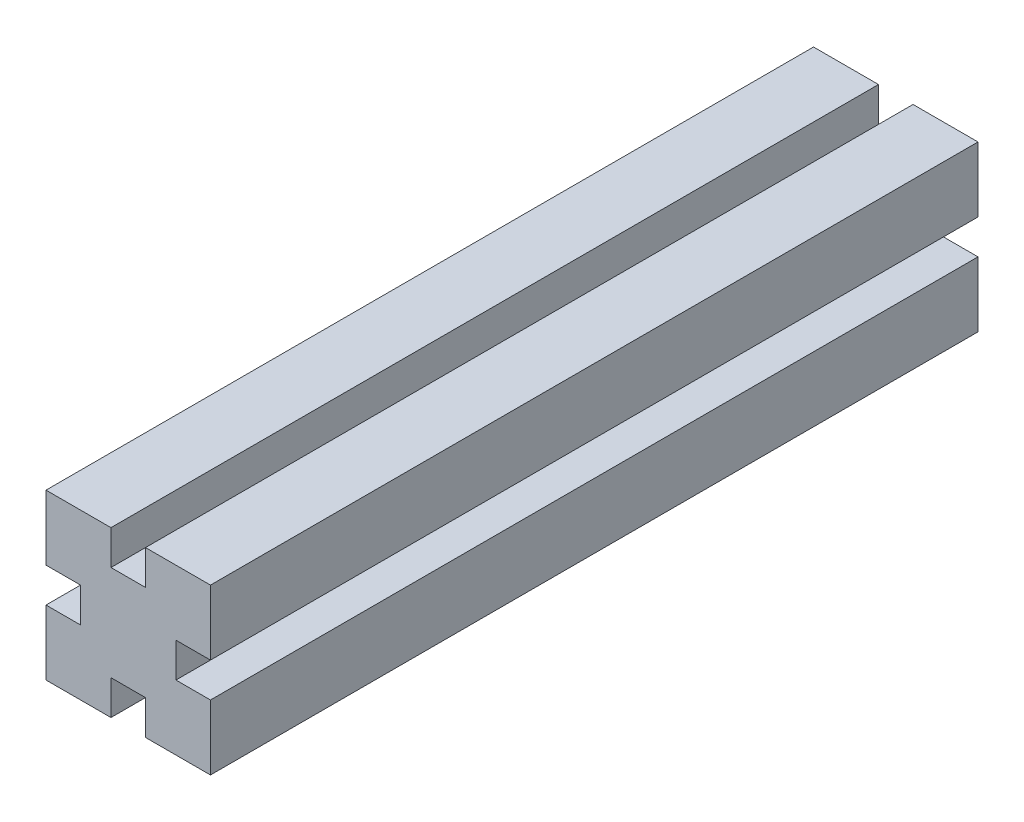
ISO-10303-21;
HEADER;
FILE_DESCRIPTION(('STEP AP214'),'2;1');
FILE_NAME('part.step','',(''),(''),'','','');
FILE_SCHEMA(('AUTOMOTIVE_DESIGN { 1 0 10303 214 1 1 1 1 }'));
ENDSEC;
DATA;
#1=APPLICATION_CONTEXT('core data for automotive mechanical design processes');
#2=APPLICATION_PROTOCOL_DEFINITION('international standard','automotive_design',2000,#1);
#3=PRODUCT_CONTEXT('',#1,'mechanical');
#4=PRODUCT('Part','Part','',(#3));
#5=PRODUCT_RELATED_PRODUCT_CATEGORY('part','',(#4));
#6=PRODUCT_DEFINITION_FORMATION('','',#4);
#7=PRODUCT_DEFINITION_CONTEXT('part definition',#1,'design');
#8=PRODUCT_DEFINITION('design','',#6,#7);
#9=PRODUCT_DEFINITION_SHAPE('','',#8);
#10=(LENGTH_UNIT() NAMED_UNIT(*) SI_UNIT(.MILLI.,.METRE.));
#11=(NAMED_UNIT(*) PLANE_ANGLE_UNIT() SI_UNIT($,.RADIAN.));
#12=(NAMED_UNIT(*) SI_UNIT($,.STERADIAN.) SOLID_ANGLE_UNIT());
#13=UNCERTAINTY_MEASURE_WITH_UNIT(LENGTH_MEASURE(1.E-05),#10,'distance_accuracy_value','');
#14=(GEOMETRIC_REPRESENTATION_CONTEXT(3) GLOBAL_UNCERTAINTY_ASSIGNED_CONTEXT((#13)) GLOBAL_UNIT_ASSIGNED_CONTEXT((#10,
#11,#12)) REPRESENTATION_CONTEXT('',''));
#15=CARTESIAN_POINT('',(0.,0.,0.));
#16=DIRECTION('',(0.,0.,1.));
#17=DIRECTION('',(1.,0.,0.));
#18=AXIS2_PLACEMENT_3D('',#15,#16,#17);
#19=CARTESIAN_POINT('',(-19.05,-4.,177.8));
#20=DIRECTION('',(1.,0.,0.));
#21=DIRECTION('',(0.,0.,-1.));
#22=AXIS2_PLACEMENT_3D('',#19,#20,#21);
#23=PLANE('',#22);
#24=DIRECTION('',(0.,-1.,0.));
#25=VECTOR('',#24,1.);
#26=CARTESIAN_POINT('',(-19.05,-4.,0.));
#27=LINE('',#26,#25);
#28=CARTESIAN_POINT('',(-19.05,-4.,0.));
#29=VERTEX_POINT('',#28);
#30=CARTESIAN_POINT('',(-19.05,-19.05,0.));
#31=VERTEX_POINT('',#30);
#32=EDGE_CURVE('E207',#29,#31,#27,.T.);
#33=ORIENTED_EDGE('',*,*,#32,.T.);
#34=DIRECTION('',(0.,0.,-1.));
#35=VECTOR('',#34,1.);
#36=CARTESIAN_POINT('',(-19.05,-19.05,177.8));
#37=LINE('',#36,#35);
#38=CARTESIAN_POINT('',(-19.05,-19.05,177.8));
#39=VERTEX_POINT('',#38);
#40=EDGE_CURVE('E11',#39,#31,#37,.T.);
#41=ORIENTED_EDGE('',*,*,#40,.F.);
#42=DIRECTION('',(0.,-1.,0.));
#43=VECTOR('',#42,1.);
#44=CARTESIAN_POINT('',(-19.05,-4.,177.8));
#45=LINE('',#44,#43);
#46=CARTESIAN_POINT('',(-19.05,-4.,177.8));
#47=VERTEX_POINT('',#46);
#48=EDGE_CURVE('E245',#47,#39,#45,.T.);
#49=ORIENTED_EDGE('',*,*,#48,.F.);
#50=DIRECTION('',(0.,0.,-1.));
#51=VECTOR('',#50,1.);
#52=CARTESIAN_POINT('',(-19.05,-4.,177.8));
#53=LINE('',#52,#51);
#54=EDGE_CURVE('E203',#47,#29,#53,.T.);
#55=ORIENTED_EDGE('',*,*,#54,.T.);
#56=EDGE_LOOP('',(#33,#41,#49,#55));
#57=FACE_BOUND('',#56,.T.);
#58=ADVANCED_FACE('F39',(#57),#23,.F.);
#59=CARTESIAN_POINT('',(-19.05,-19.05,177.8));
#60=DIRECTION('',(0.,1.,0.));
#61=DIRECTION('',(0.,0.,1.));
#62=AXIS2_PLACEMENT_3D('',#59,#60,#61);
#63=PLANE('',#62);
#64=DIRECTION('',(1.,0.,0.));
#65=VECTOR('',#64,1.);
#66=CARTESIAN_POINT('',(-19.05,-19.05,0.));
#67=LINE('',#66,#65);
#68=CARTESIAN_POINT('',(-4.,-19.05,0.));
#69=VERTEX_POINT('',#68);
#70=EDGE_CURVE('E210',#31,#69,#67,.T.);
#71=ORIENTED_EDGE('',*,*,#70,.T.);
#72=DIRECTION('',(0.,0.,-1.));
#73=VECTOR('',#72,1.);
#74=CARTESIAN_POINT('',(-4.,-19.05,177.8));
#75=LINE('',#74,#73);
#76=CARTESIAN_POINT('',(-4.,-19.05,177.8));
#77=VERTEX_POINT('',#76);
#78=EDGE_CURVE('E47',#77,#69,#75,.T.);
#79=ORIENTED_EDGE('',*,*,#78,.F.);
#80=DIRECTION('',(1.,0.,0.));
#81=VECTOR('',#80,1.);
#82=CARTESIAN_POINT('',(-19.05,-19.05,177.8));
#83=LINE('',#82,#81);
#84=EDGE_CURVE('E134',#39,#77,#83,.T.);
#85=ORIENTED_EDGE('',*,*,#84,.F.);
#86=ORIENTED_EDGE('',*,*,#40,.T.);
#87=EDGE_LOOP('',(#71,#79,#85,#86));
#88=FACE_BOUND('',#87,.T.);
#89=ADVANCED_FACE('F363',(#88),#63,.F.);
#90=CARTESIAN_POINT('',(-4.,-19.05,177.8));
#91=DIRECTION('',(-1.,0.,0.));
#92=DIRECTION('',(0.,0.,1.));
#93=AXIS2_PLACEMENT_3D('',#90,#91,#92);
#94=PLANE('',#93);
#95=DIRECTION('',(0.,1.,0.));
#96=VECTOR('',#95,1.);
#97=CARTESIAN_POINT('',(-4.,-19.05,0.));
#98=LINE('',#97,#96);
#99=CARTESIAN_POINT('',(-4.,-11.05,0.));
#100=VERTEX_POINT('',#99);
#101=EDGE_CURVE('E212',#69,#100,#98,.T.);
#102=ORIENTED_EDGE('',*,*,#101,.T.);
#103=DIRECTION('',(0.,0.,-1.));
#104=VECTOR('',#103,1.);
#105=CARTESIAN_POINT('',(-4.,-11.05,177.8));
#106=LINE('',#105,#104);
#107=CARTESIAN_POINT('',(-4.,-11.05,177.8));
#108=VERTEX_POINT('',#107);
#109=EDGE_CURVE('E288',#108,#100,#106,.T.);
#110=ORIENTED_EDGE('',*,*,#109,.F.);
#111=DIRECTION('',(0.,1.,0.));
#112=VECTOR('',#111,1.);
#113=CARTESIAN_POINT('',(-4.,-19.05,177.8));
#114=LINE('',#113,#112);
#115=EDGE_CURVE('E296',#77,#108,#114,.T.);
#116=ORIENTED_EDGE('',*,*,#115,.F.);
#117=ORIENTED_EDGE('',*,*,#78,.T.);
#118=EDGE_LOOP('',(#102,#110,#116,#117));
#119=FACE_BOUND('',#118,.T.);
#120=ADVANCED_FACE('F294',(#119),#94,.F.);
#121=CARTESIAN_POINT('',(-4.,-11.05,177.8));
#122=DIRECTION('',(0.,1.,0.));
#123=DIRECTION('',(0.,0.,1.));
#124=AXIS2_PLACEMENT_3D('',#121,#122,#123);
#125=PLANE('',#124);
#126=DIRECTION('',(1.,0.,0.));
#127=VECTOR('',#126,1.);
#128=CARTESIAN_POINT('',(-4.,-11.05,0.));
#129=LINE('',#128,#127);
#130=CARTESIAN_POINT('',(4.,-11.05,0.));
#131=VERTEX_POINT('',#130);
#132=EDGE_CURVE('E214',#100,#131,#129,.T.);
#133=ORIENTED_EDGE('',*,*,#132,.T.);
#134=DIRECTION('',(0.,0.,-1.));
#135=VECTOR('',#134,1.);
#136=CARTESIAN_POINT('',(4.,-11.05,177.8));
#137=LINE('',#136,#135);
#138=CARTESIAN_POINT('',(4.,-11.05,177.8));
#139=VERTEX_POINT('',#138);
#140=EDGE_CURVE('E285',#139,#131,#137,.T.);
#141=ORIENTED_EDGE('',*,*,#140,.F.);
#142=DIRECTION('',(1.,0.,0.));
#143=VECTOR('',#142,1.);
#144=CARTESIAN_POINT('',(-4.,-11.05,177.8));
#145=LINE('',#144,#143);
#146=EDGE_CURVE('E314',#108,#139,#145,.T.);
#147=ORIENTED_EDGE('',*,*,#146,.F.);
#148=ORIENTED_EDGE('',*,*,#109,.T.);
#149=EDGE_LOOP('',(#133,#141,#147,#148));
#150=FACE_BOUND('',#149,.T.);
#151=ADVANCED_FACE('F305',(#150),#125,.F.);
#152=CARTESIAN_POINT('',(4.,-11.05,177.8));
#153=DIRECTION('',(1.,0.,0.));
#154=DIRECTION('',(0.,0.,-1.));
#155=AXIS2_PLACEMENT_3D('',#152,#153,#154);
#156=PLANE('',#155);
#157=DIRECTION('',(0.,-1.,0.));
#158=VECTOR('',#157,1.);
#159=CARTESIAN_POINT('',(4.,-11.05,0.));
#160=LINE('',#159,#158);
#161=CARTESIAN_POINT('',(4.,-19.05,0.));
#162=VERTEX_POINT('',#161);
#163=EDGE_CURVE('E216',#131,#162,#160,.T.);
#164=ORIENTED_EDGE('',*,*,#163,.T.);
#165=DIRECTION('',(0.,0.,-1.));
#166=VECTOR('',#165,1.);
#167=CARTESIAN_POINT('',(4.,-19.05,177.8));
#168=LINE('',#167,#166);
#169=CARTESIAN_POINT('',(4.,-19.05,177.8));
#170=VERTEX_POINT('',#169);
#171=EDGE_CURVE('E282',#170,#162,#168,.T.);
#172=ORIENTED_EDGE('',*,*,#171,.F.);
#173=DIRECTION('',(0.,-1.,0.));
#174=VECTOR('',#173,1.);
#175=CARTESIAN_POINT('',(4.,-11.05,177.8));
#176=LINE('',#175,#174);
#177=EDGE_CURVE('E311',#139,#170,#176,.T.);
#178=ORIENTED_EDGE('',*,*,#177,.F.);
#179=ORIENTED_EDGE('',*,*,#140,.T.);
#180=EDGE_LOOP('',(#164,#172,#178,#179));
#181=FACE_BOUND('',#180,.T.);
#182=ADVANCED_FACE('F309',(#181),#156,.F.);
#183=CARTESIAN_POINT('',(4.,-19.05,177.8));
#184=DIRECTION('',(0.,1.,0.));
#185=DIRECTION('',(0.,0.,1.));
#186=AXIS2_PLACEMENT_3D('',#183,#184,#185);
#187=PLANE('',#186);
#188=DIRECTION('',(1.,0.,0.));
#189=VECTOR('',#188,1.);
#190=CARTESIAN_POINT('',(4.,-19.05,0.));
#191=LINE('',#190,#189);
#192=CARTESIAN_POINT('',(19.05,-19.05,0.));
#193=VERTEX_POINT('',#192);
#194=EDGE_CURVE('E218',#162,#193,#191,.T.);
#195=ORIENTED_EDGE('',*,*,#194,.T.);
#196=DIRECTION('',(0.,0.,-1.));
#197=VECTOR('',#196,1.);
#198=CARTESIAN_POINT('',(19.05,-19.05,177.8));
#199=LINE('',#198,#197);
#200=CARTESIAN_POINT('',(19.05,-19.05,177.8));
#201=VERTEX_POINT('',#200);
#202=EDGE_CURVE('E279',#201,#193,#199,.T.);
#203=ORIENTED_EDGE('',*,*,#202,.F.);
#204=DIRECTION('',(1.,0.,0.));
#205=VECTOR('',#204,1.);
#206=CARTESIAN_POINT('',(4.,-19.05,177.8));
#207=LINE('',#206,#205);
#208=EDGE_CURVE('E313',#170,#201,#207,.T.);
#209=ORIENTED_EDGE('',*,*,#208,.F.);
#210=ORIENTED_EDGE('',*,*,#171,.T.);
#211=EDGE_LOOP('',(#195,#203,#209,#210));
#212=FACE_BOUND('',#211,.T.);
#213=ADVANCED_FACE('F376',(#212),#187,.F.);
#214=CARTESIAN_POINT('',(19.05,-19.05,177.8));
#215=DIRECTION('',(-1.,0.,0.));
#216=DIRECTION('',(0.,0.,1.));
#217=AXIS2_PLACEMENT_3D('',#214,#215,#216);
#218=PLANE('',#217);
#219=DIRECTION('',(0.,1.,0.));
#220=VECTOR('',#219,1.);
#221=CARTESIAN_POINT('',(19.05,-19.05,0.));
#222=LINE('',#221,#220);
#223=CARTESIAN_POINT('',(19.05,-4.,0.));
#224=VERTEX_POINT('',#223);
#225=EDGE_CURVE('E220',#193,#224,#222,.T.);
#226=ORIENTED_EDGE('',*,*,#225,.T.);
#227=DIRECTION('',(0.,0.,-1.));
#228=VECTOR('',#227,1.);
#229=CARTESIAN_POINT('',(19.05,-4.,177.8));
#230=LINE('',#229,#228);
#231=CARTESIAN_POINT('',(19.05,-4.,177.8));
#232=VERTEX_POINT('',#231);
#233=EDGE_CURVE('E276',#232,#224,#230,.T.);
#234=ORIENTED_EDGE('',*,*,#233,.F.);
#235=DIRECTION('',(0.,1.,0.));
#236=VECTOR('',#235,1.);
#237=CARTESIAN_POINT('',(19.05,-19.05,177.8));
#238=LINE('',#237,#236);
#239=EDGE_CURVE('E316',#201,#232,#238,.T.);
#240=ORIENTED_EDGE('',*,*,#239,.F.);
#241=ORIENTED_EDGE('',*,*,#202,.T.);
#242=EDGE_LOOP('',(#226,#234,#240,#241));
#243=FACE_BOUND('',#242,.T.);
#244=ADVANCED_FACE('F379',(#243),#218,.F.);
#245=CARTESIAN_POINT('',(19.05,-4.,177.8));
#246=DIRECTION('',(0.,-1.,0.));
#247=DIRECTION('',(0.,0.,-1.));
#248=AXIS2_PLACEMENT_3D('',#245,#246,#247);
#249=PLANE('',#248);
#250=DIRECTION('',(-1.,0.,0.));
#251=VECTOR('',#250,1.);
#252=CARTESIAN_POINT('',(19.05,-4.,0.));
#253=LINE('',#252,#251);
#254=CARTESIAN_POINT('',(11.05,-4.,0.));
#255=VERTEX_POINT('',#254);
#256=EDGE_CURVE('E222',#224,#255,#253,.T.);
#257=ORIENTED_EDGE('',*,*,#256,.T.);
#258=DIRECTION('',(0.,0.,-1.));
#259=VECTOR('',#258,1.);
#260=CARTESIAN_POINT('',(11.05,-4.,177.8));
#261=LINE('',#260,#259);
#262=CARTESIAN_POINT('',(11.05,-4.,177.8));
#263=VERTEX_POINT('',#262);
#264=EDGE_CURVE('E273',#263,#255,#261,.T.);
#265=ORIENTED_EDGE('',*,*,#264,.F.);
#266=DIRECTION('',(-1.,0.,0.));
#267=VECTOR('',#266,1.);
#268=CARTESIAN_POINT('',(19.05,-4.,177.8));
#269=LINE('',#268,#267);
#270=EDGE_CURVE('E322',#232,#263,#269,.T.);
#271=ORIENTED_EDGE('',*,*,#270,.F.);
#272=ORIENTED_EDGE('',*,*,#233,.T.);
#273=EDGE_LOOP('',(#257,#265,#271,#272));
#274=FACE_BOUND('',#273,.T.);
#275=ADVANCED_FACE('F383',(#274),#249,.F.);
#276=CARTESIAN_POINT('',(11.05,-4.,177.8));
#277=DIRECTION('',(-1.,0.,0.));
#278=DIRECTION('',(0.,0.,1.));
#279=AXIS2_PLACEMENT_3D('',#276,#277,#278);
#280=PLANE('',#279);
#281=DIRECTION('',(0.,1.,0.));
#282=VECTOR('',#281,1.);
#283=CARTESIAN_POINT('',(11.05,-4.,0.));
#284=LINE('',#283,#282);
#285=CARTESIAN_POINT('',(11.05,4.,0.));
#286=VERTEX_POINT('',#285);
#287=EDGE_CURVE('E224',#255,#286,#284,.T.);
#288=ORIENTED_EDGE('',*,*,#287,.T.);
#289=DIRECTION('',(0.,0.,-1.));
#290=VECTOR('',#289,1.);
#291=CARTESIAN_POINT('',(11.05,4.,177.8));
#292=LINE('',#291,#290);
#293=CARTESIAN_POINT('',(11.05,4.,177.8));
#294=VERTEX_POINT('',#293);
#295=EDGE_CURVE('E270',#294,#286,#292,.T.);
#296=ORIENTED_EDGE('',*,*,#295,.F.);
#297=DIRECTION('',(0.,1.,0.));
#298=VECTOR('',#297,1.);
#299=CARTESIAN_POINT('',(11.05,-4.,177.8));
#300=LINE('',#299,#298);
#301=EDGE_CURVE('E324',#263,#294,#300,.T.);
#302=ORIENTED_EDGE('',*,*,#301,.F.);
#303=ORIENTED_EDGE('',*,*,#264,.T.);
#304=EDGE_LOOP('',(#288,#296,#302,#303));
#305=FACE_BOUND('',#304,.T.);
#306=ADVANCED_FACE('F387',(#305),#280,.F.);
#307=CARTESIAN_POINT('',(11.05,4.,177.8));
#308=DIRECTION('',(0.,1.,0.));
#309=DIRECTION('',(0.,0.,1.));
#310=AXIS2_PLACEMENT_3D('',#307,#308,#309);
#311=PLANE('',#310);
#312=DIRECTION('',(1.,0.,0.));
#313=VECTOR('',#312,1.);
#314=CARTESIAN_POINT('',(11.05,4.,0.));
#315=LINE('',#314,#313);
#316=CARTESIAN_POINT('',(19.05,4.,0.));
#317=VERTEX_POINT('',#316);
#318=EDGE_CURVE('E226',#286,#317,#315,.T.);
#319=ORIENTED_EDGE('',*,*,#318,.T.);
#320=DIRECTION('',(0.,0.,-1.));
#321=VECTOR('',#320,1.);
#322=CARTESIAN_POINT('',(19.05,4.,177.8));
#323=LINE('',#322,#321);
#324=CARTESIAN_POINT('',(19.05,4.,177.8));
#325=VERTEX_POINT('',#324);
#326=EDGE_CURVE('E267',#325,#317,#323,.T.);
#327=ORIENTED_EDGE('',*,*,#326,.F.);
#328=DIRECTION('',(1.,0.,0.));
#329=VECTOR('',#328,1.);
#330=CARTESIAN_POINT('',(11.05,4.,177.8));
#331=LINE('',#330,#329);
#332=EDGE_CURVE('E326',#294,#325,#331,.T.);
#333=ORIENTED_EDGE('',*,*,#332,.F.);
#334=ORIENTED_EDGE('',*,*,#295,.T.);
#335=EDGE_LOOP('',(#319,#327,#333,#334));
#336=FACE_BOUND('',#335,.T.);
#337=ADVANCED_FACE('F391',(#336),#311,.F.);
#338=CARTESIAN_POINT('',(19.05,4.,177.8));
#339=DIRECTION('',(-1.,0.,0.));
#340=DIRECTION('',(0.,0.,1.));
#341=AXIS2_PLACEMENT_3D('',#338,#339,#340);
#342=PLANE('',#341);
#343=DIRECTION('',(0.,1.,0.));
#344=VECTOR('',#343,1.);
#345=CARTESIAN_POINT('',(19.05,4.,0.));
#346=LINE('',#345,#344);
#347=CARTESIAN_POINT('',(19.05,19.05,0.));
#348=VERTEX_POINT('',#347);
#349=EDGE_CURVE('E228',#317,#348,#346,.T.);
#350=ORIENTED_EDGE('',*,*,#349,.T.);
#351=DIRECTION('',(0.,0.,-1.));
#352=VECTOR('',#351,1.);
#353=CARTESIAN_POINT('',(19.05,19.05,177.8));
#354=LINE('',#353,#352);
#355=CARTESIAN_POINT('',(19.05,19.05,177.8));
#356=VERTEX_POINT('',#355);
#357=EDGE_CURVE('E264',#356,#348,#354,.T.);
#358=ORIENTED_EDGE('',*,*,#357,.F.);
#359=DIRECTION('',(0.,1.,0.));
#360=VECTOR('',#359,1.);
#361=CARTESIAN_POINT('',(19.05,4.,177.8));
#362=LINE('',#361,#360);
#363=EDGE_CURVE('E328',#325,#356,#362,.T.);
#364=ORIENTED_EDGE('',*,*,#363,.F.);
#365=ORIENTED_EDGE('',*,*,#326,.T.);
#366=EDGE_LOOP('',(#350,#358,#364,#365));
#367=FACE_BOUND('',#366,.T.);
#368=ADVANCED_FACE('F395',(#367),#342,.F.);
#369=CARTESIAN_POINT('',(19.05,19.05,177.8));
#370=DIRECTION('',(0.,-1.,0.));
#371=DIRECTION('',(0.,0.,-1.));
#372=AXIS2_PLACEMENT_3D('',#369,#370,#371);
#373=PLANE('',#372);
#374=DIRECTION('',(-1.,0.,0.));
#375=VECTOR('',#374,1.);
#376=CARTESIAN_POINT('',(19.05,19.05,0.));
#377=LINE('',#376,#375);
#378=CARTESIAN_POINT('',(4.,19.05,0.));
#379=VERTEX_POINT('',#378);
#380=EDGE_CURVE('E230',#348,#379,#377,.T.);
#381=ORIENTED_EDGE('',*,*,#380,.T.);
#382=DIRECTION('',(0.,0.,-1.));
#383=VECTOR('',#382,1.);
#384=CARTESIAN_POINT('',(4.,19.05,177.8));
#385=LINE('',#384,#383);
#386=CARTESIAN_POINT('',(4.,19.05,177.8));
#387=VERTEX_POINT('',#386);
#388=EDGE_CURVE('E261',#387,#379,#385,.T.);
#389=ORIENTED_EDGE('',*,*,#388,.F.);
#390=DIRECTION('',(-1.,0.,0.));
#391=VECTOR('',#390,1.);
#392=CARTESIAN_POINT('',(19.05,19.05,177.8));
#393=LINE('',#392,#391);
#394=EDGE_CURVE('E330',#356,#387,#393,.T.);
#395=ORIENTED_EDGE('',*,*,#394,.F.);
#396=ORIENTED_EDGE('',*,*,#357,.T.);
#397=EDGE_LOOP('',(#381,#389,#395,#396));
#398=FACE_BOUND('',#397,.T.);
#399=ADVANCED_FACE('F399',(#398),#373,.F.);
#400=CARTESIAN_POINT('',(4.,19.05,177.8));
#401=DIRECTION('',(1.,0.,0.));
#402=DIRECTION('',(0.,0.,-1.));
#403=AXIS2_PLACEMENT_3D('',#400,#401,#402);
#404=PLANE('',#403);
#405=DIRECTION('',(0.,-1.,0.));
#406=VECTOR('',#405,1.);
#407=CARTESIAN_POINT('',(4.,19.05,0.));
#408=LINE('',#407,#406);
#409=CARTESIAN_POINT('',(4.,11.05,0.));
#410=VERTEX_POINT('',#409);
#411=EDGE_CURVE('E232',#379,#410,#408,.T.);
#412=ORIENTED_EDGE('',*,*,#411,.T.);
#413=DIRECTION('',(0.,0.,-1.));
#414=VECTOR('',#413,1.);
#415=CARTESIAN_POINT('',(4.,11.05,177.8));
#416=LINE('',#415,#414);
#417=CARTESIAN_POINT('',(4.,11.05,177.8));
#418=VERTEX_POINT('',#417);
#419=EDGE_CURVE('E258',#418,#410,#416,.T.);
#420=ORIENTED_EDGE('',*,*,#419,.F.);
#421=DIRECTION('',(0.,-1.,0.));
#422=VECTOR('',#421,1.);
#423=CARTESIAN_POINT('',(4.,19.05,177.8));
#424=LINE('',#423,#422);
#425=EDGE_CURVE('E332',#387,#418,#424,.T.);
#426=ORIENTED_EDGE('',*,*,#425,.F.);
#427=ORIENTED_EDGE('',*,*,#388,.T.);
#428=EDGE_LOOP('',(#412,#420,#426,#427));
#429=FACE_BOUND('',#428,.T.);
#430=ADVANCED_FACE('F403',(#429),#404,.F.);
#431=CARTESIAN_POINT('',(4.,11.05,177.8));
#432=DIRECTION('',(0.,-1.,0.));
#433=DIRECTION('',(0.,0.,-1.));
#434=AXIS2_PLACEMENT_3D('',#431,#432,#433);
#435=PLANE('',#434);
#436=DIRECTION('',(-1.,0.,0.));
#437=VECTOR('',#436,1.);
#438=CARTESIAN_POINT('',(4.,11.05,0.));
#439=LINE('',#438,#437);
#440=CARTESIAN_POINT('',(-4.,11.05,0.));
#441=VERTEX_POINT('',#440);
#442=EDGE_CURVE('E234',#410,#441,#439,.T.);
#443=ORIENTED_EDGE('',*,*,#442,.T.);
#444=DIRECTION('',(0.,0.,-1.));
#445=VECTOR('',#444,1.);
#446=CARTESIAN_POINT('',(-4.,11.05,177.8));
#447=LINE('',#446,#445);
#448=CARTESIAN_POINT('',(-4.,11.05,177.8));
#449=VERTEX_POINT('',#448);
#450=EDGE_CURVE('E255',#449,#441,#447,.T.);
#451=ORIENTED_EDGE('',*,*,#450,.F.);
#452=DIRECTION('',(-1.,0.,0.));
#453=VECTOR('',#452,1.);
#454=CARTESIAN_POINT('',(4.,11.05,177.8));
#455=LINE('',#454,#453);
#456=EDGE_CURVE('E334',#418,#449,#455,.T.);
#457=ORIENTED_EDGE('',*,*,#456,.F.);
#458=ORIENTED_EDGE('',*,*,#419,.T.);
#459=EDGE_LOOP('',(#443,#451,#457,#458));
#460=FACE_BOUND('',#459,.T.);
#461=ADVANCED_FACE('F407',(#460),#435,.F.);
#462=CARTESIAN_POINT('',(-4.,11.05,177.8));
#463=DIRECTION('',(-1.,0.,0.));
#464=DIRECTION('',(0.,0.,1.));
#465=AXIS2_PLACEMENT_3D('',#462,#463,#464);
#466=PLANE('',#465);
#467=DIRECTION('',(0.,1.,0.));
#468=VECTOR('',#467,1.);
#469=CARTESIAN_POINT('',(-4.,11.05,0.));
#470=LINE('',#469,#468);
#471=CARTESIAN_POINT('',(-4.,19.05,0.));
#472=VERTEX_POINT('',#471);
#473=EDGE_CURVE('E236',#441,#472,#470,.T.);
#474=ORIENTED_EDGE('',*,*,#473,.T.);
#475=DIRECTION('',(0.,0.,-1.));
#476=VECTOR('',#475,1.);
#477=CARTESIAN_POINT('',(-4.,19.05,177.8));
#478=LINE('',#477,#476);
#479=CARTESIAN_POINT('',(-4.,19.05,177.8));
#480=VERTEX_POINT('',#479);
#481=EDGE_CURVE('E252',#480,#472,#478,.T.);
#482=ORIENTED_EDGE('',*,*,#481,.F.);
#483=DIRECTION('',(0.,1.,0.));
#484=VECTOR('',#483,1.);
#485=CARTESIAN_POINT('',(-4.,11.05,177.8));
#486=LINE('',#485,#484);
#487=EDGE_CURVE('E336',#449,#480,#486,.T.);
#488=ORIENTED_EDGE('',*,*,#487,.F.);
#489=ORIENTED_EDGE('',*,*,#450,.T.);
#490=EDGE_LOOP('',(#474,#482,#488,#489));
#491=FACE_BOUND('',#490,.T.);
#492=ADVANCED_FACE('F411',(#491),#466,.F.);
#493=CARTESIAN_POINT('',(-4.,19.05,177.8));
#494=DIRECTION('',(0.,-1.,0.));
#495=DIRECTION('',(0.,0.,-1.));
#496=AXIS2_PLACEMENT_3D('',#493,#494,#495);
#497=PLANE('',#496);
#498=DIRECTION('',(-1.,0.,0.));
#499=VECTOR('',#498,1.);
#500=CARTESIAN_POINT('',(-4.,19.05,0.));
#501=LINE('',#500,#499);
#502=CARTESIAN_POINT('',(-19.05,19.05,0.));
#503=VERTEX_POINT('',#502);
#504=EDGE_CURVE('E238',#472,#503,#501,.T.);
#505=ORIENTED_EDGE('',*,*,#504,.T.);
#506=DIRECTION('',(0.,0.,-1.));
#507=VECTOR('',#506,1.);
#508=CARTESIAN_POINT('',(-19.05,19.05,177.8));
#509=LINE('',#508,#507);
#510=CARTESIAN_POINT('',(-19.05,19.05,177.8));
#511=VERTEX_POINT('',#510);
#512=EDGE_CURVE('E249',#511,#503,#509,.T.);
#513=ORIENTED_EDGE('',*,*,#512,.F.);
#514=DIRECTION('',(-1.,0.,0.));
#515=VECTOR('',#514,1.);
#516=CARTESIAN_POINT('',(-4.,19.05,177.8));
#517=LINE('',#516,#515);
#518=EDGE_CURVE('E338',#480,#511,#517,.T.);
#519=ORIENTED_EDGE('',*,*,#518,.F.);
#520=ORIENTED_EDGE('',*,*,#481,.T.);
#521=EDGE_LOOP('',(#505,#513,#519,#520));
#522=FACE_BOUND('',#521,.T.);
#523=ADVANCED_FACE('F344',(#522),#497,.F.);
#524=CARTESIAN_POINT('',(-19.05,19.05,177.8));
#525=DIRECTION('',(1.,0.,0.));
#526=DIRECTION('',(0.,0.,-1.));
#527=AXIS2_PLACEMENT_3D('',#524,#525,#526);
#528=PLANE('',#527);
#529=DIRECTION('',(0.,-1.,0.));
#530=VECTOR('',#529,1.);
#531=CARTESIAN_POINT('',(-19.05,19.05,0.));
#532=LINE('',#531,#530);
#533=CARTESIAN_POINT('',(-19.05,4.,0.));
#534=VERTEX_POINT('',#533);
#535=EDGE_CURVE('E240',#503,#534,#532,.T.);
#536=ORIENTED_EDGE('',*,*,#535,.T.);
#537=DIRECTION('',(0.,0.,-1.));
#538=VECTOR('',#537,1.);
#539=CARTESIAN_POINT('',(-19.05,4.,177.8));
#540=LINE('',#539,#538);
#541=CARTESIAN_POINT('',(-19.05,4.,177.8));
#542=VERTEX_POINT('',#541);
#543=EDGE_CURVE('E198',#542,#534,#540,.T.);
#544=ORIENTED_EDGE('',*,*,#543,.F.);
#545=DIRECTION('',(0.,-1.,0.));
#546=VECTOR('',#545,1.);
#547=CARTESIAN_POINT('',(-19.05,19.05,177.8));
#548=LINE('',#547,#546);
#549=EDGE_CURVE('E189',#511,#542,#548,.T.);
#550=ORIENTED_EDGE('',*,*,#549,.F.);
#551=ORIENTED_EDGE('',*,*,#512,.T.);
#552=EDGE_LOOP('',(#536,#544,#550,#551));
#553=FACE_BOUND('',#552,.T.);
#554=ADVANCED_FACE('F348',(#553),#528,.F.);
#555=CARTESIAN_POINT('',(-19.05,4.,177.8));
#556=DIRECTION('',(0.,1.,0.));
#557=DIRECTION('',(0.,0.,1.));
#558=AXIS2_PLACEMENT_3D('',#555,#556,#557);
#559=PLANE('',#558);
#560=DIRECTION('',(1.,0.,0.));
#561=VECTOR('',#560,1.);
#562=CARTESIAN_POINT('',(-19.05,4.,0.));
#563=LINE('',#562,#561);
#564=CARTESIAN_POINT('',(-11.05,4.,0.));
#565=VERTEX_POINT('',#564);
#566=EDGE_CURVE('E197',#534,#565,#563,.T.);
#567=ORIENTED_EDGE('',*,*,#566,.T.);
#568=DIRECTION('',(0.,0.,-1.));
#569=VECTOR('',#568,1.);
#570=CARTESIAN_POINT('',(-11.05,4.,177.8));
#571=LINE('',#570,#569);
#572=CARTESIAN_POINT('',(-11.05,4.,177.8));
#573=VERTEX_POINT('',#572);
#574=EDGE_CURVE('E194',#573,#565,#571,.T.);
#575=ORIENTED_EDGE('',*,*,#574,.F.);
#576=DIRECTION('',(1.,0.,0.));
#577=VECTOR('',#576,1.);
#578=CARTESIAN_POINT('',(-19.05,4.,177.8));
#579=LINE('',#578,#577);
#580=EDGE_CURVE('E183',#542,#573,#579,.T.);
#581=ORIENTED_EDGE('',*,*,#580,.F.);
#582=ORIENTED_EDGE('',*,*,#543,.T.);
#583=EDGE_LOOP('',(#567,#575,#581,#582));
#584=FACE_BOUND('',#583,.T.);
#585=ADVANCED_FACE('F195',(#584),#559,.F.);
#586=CARTESIAN_POINT('',(-11.05,4.,177.8));
#587=DIRECTION('',(1.,0.,0.));
#588=DIRECTION('',(0.,0.,-1.));
#589=AXIS2_PLACEMENT_3D('',#586,#587,#588);
#590=PLANE('',#589);
#591=DIRECTION('',(0.,-1.,0.));
#592=VECTOR('',#591,1.);
#593=CARTESIAN_POINT('',(-11.05,4.,0.));
#594=LINE('',#593,#592);
#595=CARTESIAN_POINT('',(-11.05,-4.,0.));
#596=VERTEX_POINT('',#595);
#597=EDGE_CURVE('E120',#565,#596,#594,.T.);
#598=ORIENTED_EDGE('',*,*,#597,.T.);
#599=DIRECTION('',(0.,0.,-1.));
#600=VECTOR('',#599,1.);
#601=CARTESIAN_POINT('',(-11.05,-4.,177.8));
#602=LINE('',#601,#600);
#603=CARTESIAN_POINT('',(-11.05,-4.,177.8));
#604=VERTEX_POINT('',#603);
#605=EDGE_CURVE('E199',#604,#596,#602,.T.);
#606=ORIENTED_EDGE('',*,*,#605,.F.);
#607=DIRECTION('',(0.,-1.,0.));
#608=VECTOR('',#607,1.);
#609=CARTESIAN_POINT('',(-11.05,4.,177.8));
#610=LINE('',#609,#608);
#611=EDGE_CURVE('E187',#573,#604,#610,.T.);
#612=ORIENTED_EDGE('',*,*,#611,.F.);
#613=ORIENTED_EDGE('',*,*,#574,.T.);
#614=EDGE_LOOP('',(#598,#606,#612,#613));
#615=FACE_BOUND('',#614,.T.);
#616=ADVANCED_FACE('F201',(#615),#590,.F.);
#617=CARTESIAN_POINT('',(-11.05,-4.,177.8));
#618=DIRECTION('',(0.,-1.,0.));
#619=DIRECTION('',(0.,0.,-1.));
#620=AXIS2_PLACEMENT_3D('',#617,#618,#619);
#621=PLANE('',#620);
#622=DIRECTION('',(-1.,0.,0.));
#623=VECTOR('',#622,1.);
#624=CARTESIAN_POINT('',(-11.05,-4.,0.));
#625=LINE('',#624,#623);
#626=EDGE_CURVE('E126',#596,#29,#625,.T.);
#627=ORIENTED_EDGE('',*,*,#626,.T.);
#628=ORIENTED_EDGE('',*,*,#54,.F.);
#629=DIRECTION('',(-1.,0.,0.));
#630=VECTOR('',#629,1.);
#631=CARTESIAN_POINT('',(-11.05,-4.,177.8));
#632=LINE('',#631,#630);
#633=EDGE_CURVE('E55',#604,#47,#632,.T.);
#634=ORIENTED_EDGE('',*,*,#633,.F.);
#635=ORIENTED_EDGE('',*,*,#605,.T.);
#636=EDGE_LOOP('',(#627,#628,#634,#635));
#637=FACE_BOUND('',#636,.T.);
#638=ADVANCED_FACE('F352',(#637),#621,.F.);
#639=CARTESIAN_POINT('',(0.,0.,177.8));
#640=DIRECTION('',(0.,0.,1.));
#641=DIRECTION('',(1.,0.,0.));
#642=AXIS2_PLACEMENT_3D('',#639,#640,#641);
#643=PLANE('',#642);
#644=ORIENTED_EDGE('',*,*,#48,.T.);
#645=ORIENTED_EDGE('',*,*,#84,.T.);
#646=ORIENTED_EDGE('',*,*,#115,.T.);
#647=ORIENTED_EDGE('',*,*,#146,.T.);
#648=ORIENTED_EDGE('',*,*,#177,.T.);
#649=ORIENTED_EDGE('',*,*,#208,.T.);
#650=ORIENTED_EDGE('',*,*,#239,.T.);
#651=ORIENTED_EDGE('',*,*,#270,.T.);
#652=ORIENTED_EDGE('',*,*,#301,.T.);
#653=ORIENTED_EDGE('',*,*,#332,.T.);
#654=ORIENTED_EDGE('',*,*,#363,.T.);
#655=ORIENTED_EDGE('',*,*,#394,.T.);
#656=ORIENTED_EDGE('',*,*,#425,.T.);
#657=ORIENTED_EDGE('',*,*,#456,.T.);
#658=ORIENTED_EDGE('',*,*,#487,.T.);
#659=ORIENTED_EDGE('',*,*,#518,.T.);
#660=ORIENTED_EDGE('',*,*,#549,.T.);
#661=ORIENTED_EDGE('',*,*,#580,.T.);
#662=ORIENTED_EDGE('',*,*,#611,.T.);
#663=ORIENTED_EDGE('',*,*,#633,.T.);
#664=EDGE_LOOP('',(#644,#645,#646,#647,#648,#649,#650,#651,#652,#653,#654,#655,#656,#657,#658,
#659,#660,#661,#662,#663));
#665=FACE_BOUND('',#664,.T.);
#666=ADVANCED_FACE('F185',(#665),#643,.T.);
#667=CARTESIAN_POINT('',(0.,0.,0.));
#668=DIRECTION('',(0.,0.,1.));
#669=DIRECTION('',(1.,0.,0.));
#670=AXIS2_PLACEMENT_3D('',#667,#668,#669);
#671=PLANE('',#670);
#672=ORIENTED_EDGE('',*,*,#32,.F.);
#673=ORIENTED_EDGE('',*,*,#626,.F.);
#674=ORIENTED_EDGE('',*,*,#597,.F.);
#675=ORIENTED_EDGE('',*,*,#566,.F.);
#676=ORIENTED_EDGE('',*,*,#535,.F.);
#677=ORIENTED_EDGE('',*,*,#504,.F.);
#678=ORIENTED_EDGE('',*,*,#473,.F.);
#679=ORIENTED_EDGE('',*,*,#442,.F.);
#680=ORIENTED_EDGE('',*,*,#411,.F.);
#681=ORIENTED_EDGE('',*,*,#380,.F.);
#682=ORIENTED_EDGE('',*,*,#349,.F.);
#683=ORIENTED_EDGE('',*,*,#318,.F.);
#684=ORIENTED_EDGE('',*,*,#287,.F.);
#685=ORIENTED_EDGE('',*,*,#256,.F.);
#686=ORIENTED_EDGE('',*,*,#225,.F.);
#687=ORIENTED_EDGE('',*,*,#194,.F.);
#688=ORIENTED_EDGE('',*,*,#163,.F.);
#689=ORIENTED_EDGE('',*,*,#132,.F.);
#690=ORIENTED_EDGE('',*,*,#101,.F.);
#691=ORIENTED_EDGE('',*,*,#70,.F.);
#692=EDGE_LOOP('',(#672,#673,#674,#675,#676,#677,#678,#679,#680,#681,#682,#683,#684,#685,#686,
#687,#688,#689,#690,#691));
#693=FACE_BOUND('',#692,.T.);
#694=ADVANCED_FACE('F300',(#693),#671,.F.);
#695=CLOSED_SHELL('',(#58,#89,#120,#151,#182,#213,#244,#275,#306,#337,#368,#399,#430,#461,#492,
#523,#554,#585,#616,#638,#666,#694));
#696=MANIFOLD_SOLID_BREP('B2',#695);
#697=ADVANCED_BREP_SHAPE_REPRESENTATION('',(#18,#696),#14);
#698=SHAPE_DEFINITION_REPRESENTATION(#9,#697);
ENDSEC;
END-ISO-10303-21;
